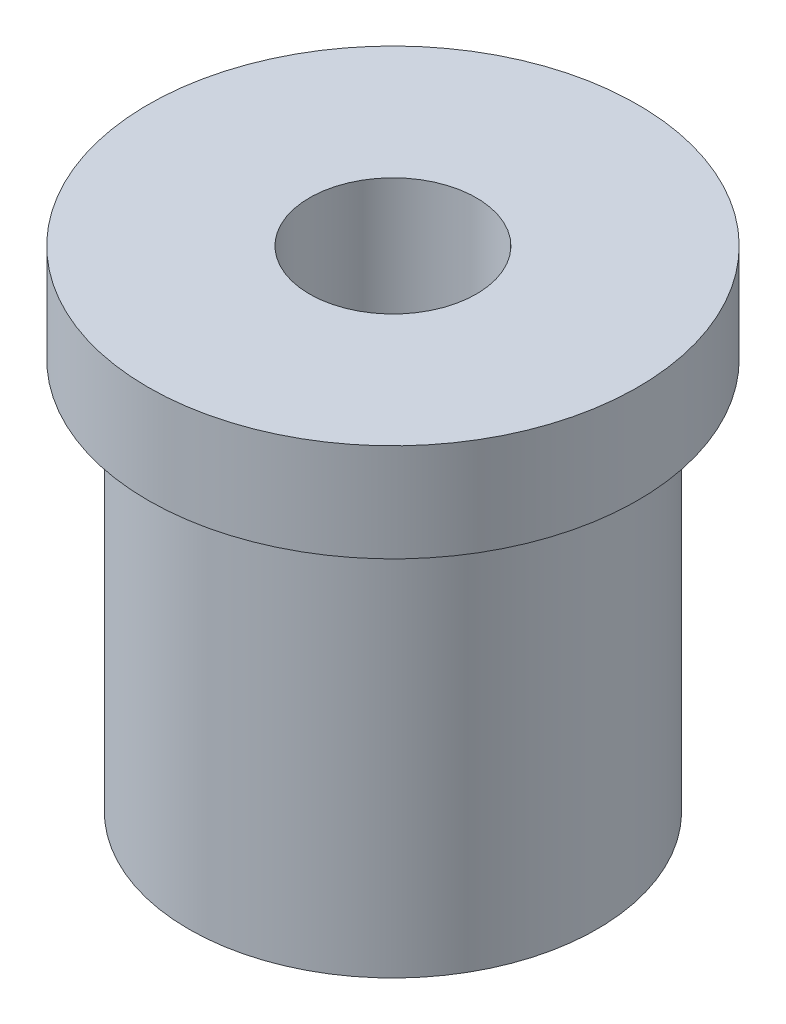
ISO-10303-21;
HEADER;
FILE_DESCRIPTION(('STEP AP214'),'2;1');
FILE_NAME('part.step','',(''),(''),'','','');
FILE_SCHEMA(('AUTOMOTIVE_DESIGN { 1 0 10303 214 1 1 1 1 }'));
ENDSEC;
DATA;
#1=APPLICATION_CONTEXT('core data for automotive mechanical design processes');
#2=APPLICATION_PROTOCOL_DEFINITION('international standard','automotive_design',2000,#1);
#3=PRODUCT_CONTEXT('',#1,'mechanical');
#4=PRODUCT('Part','Part','',(#3));
#5=PRODUCT_RELATED_PRODUCT_CATEGORY('part','',(#4));
#6=PRODUCT_DEFINITION_FORMATION('','',#4);
#7=PRODUCT_DEFINITION_CONTEXT('part definition',#1,'design');
#8=PRODUCT_DEFINITION('design','',#6,#7);
#9=PRODUCT_DEFINITION_SHAPE('','',#8);
#10=(LENGTH_UNIT() NAMED_UNIT(*) SI_UNIT(.MILLI.,.METRE.));
#11=(NAMED_UNIT(*) PLANE_ANGLE_UNIT() SI_UNIT($,.RADIAN.));
#12=(NAMED_UNIT(*) SI_UNIT($,.STERADIAN.) SOLID_ANGLE_UNIT());
#13=UNCERTAINTY_MEASURE_WITH_UNIT(LENGTH_MEASURE(1.E-05),#10,'distance_accuracy_value','');
#14=(GEOMETRIC_REPRESENTATION_CONTEXT(3) GLOBAL_UNCERTAINTY_ASSIGNED_CONTEXT((#13)) GLOBAL_UNIT_ASSIGNED_CONTEXT((#10,
#11,#12)) REPRESENTATION_CONTEXT('',''));
#15=CARTESIAN_POINT('',(0.,0.,0.));
#16=DIRECTION('',(0.,0.,1.));
#17=DIRECTION('',(1.,0.,0.));
#18=AXIS2_PLACEMENT_3D('',#15,#16,#17);
#19=CARTESIAN_POINT('',(0.,3.175,0.));
#20=DIRECTION('',(0.,-1.,0.));
#21=DIRECTION('',(0.,0.,-1.));
#22=AXIS2_PLACEMENT_3D('',#19,#20,#21);
#23=CYLINDRICAL_SURFACE('',#22,7.9375);
#24=CARTESIAN_POINT('',(0.,3.175,0.));
#25=DIRECTION('',(0.,1.,0.));
#26=DIRECTION('',(0.,0.,1.));
#27=AXIS2_PLACEMENT_3D('',#24,#25,#26);
#28=CIRCLE('',#27,7.9375);
#29=CARTESIAN_POINT('',(0.,3.175,7.9375));
#30=VERTEX_POINT('',#29);
#31=EDGE_CURVE('E46',#30,#30,#28,.T.);
#32=ORIENTED_EDGE('',*,*,#31,.F.);
#33=EDGE_LOOP('',(#32));
#34=FACE_BOUND('',#33,.T.);
#35=CARTESIAN_POINT('',(0.,0.,0.));
#36=DIRECTION('',(0.,1.,0.));
#37=DIRECTION('',(0.,0.,1.));
#38=AXIS2_PLACEMENT_3D('',#35,#36,#37);
#39=CIRCLE('',#38,7.9375);
#40=CARTESIAN_POINT('',(0.,0.,7.9375));
#41=VERTEX_POINT('',#40);
#42=EDGE_CURVE('E42',#41,#41,#39,.T.);
#43=ORIENTED_EDGE('',*,*,#42,.T.);
#44=EDGE_LOOP('',(#43));
#45=FACE_BOUND('',#44,.T.);
#46=ADVANCED_FACE('F39',(#34,#45),#23,.T.);
#47=CARTESIAN_POINT('',(0.,3.175,0.));
#48=DIRECTION('',(0.,-1.,0.));
#49=DIRECTION('',(0.,0.,-1.));
#50=AXIS2_PLACEMENT_3D('',#47,#48,#49);
#51=CYLINDRICAL_SURFACE('',#50,2.7051);
#52=CARTESIAN_POINT('',(0.,3.175,0.));
#53=DIRECTION('',(0.,1.,0.));
#54=DIRECTION('',(0.,0.,1.));
#55=AXIS2_PLACEMENT_3D('',#52,#53,#54);
#56=CIRCLE('',#55,2.7051);
#57=CARTESIAN_POINT('',(0.,3.175,2.7051));
#58=VERTEX_POINT('',#57);
#59=EDGE_CURVE('E10',#58,#58,#56,.T.);
#60=ORIENTED_EDGE('',*,*,#59,.T.);
#61=EDGE_LOOP('',(#60));
#62=FACE_BOUND('',#61,.T.);
#63=CARTESIAN_POINT('',(0.,-12.7,0.));
#64=DIRECTION('',(0.,1.,0.));
#65=DIRECTION('',(0.,0.,1.));
#66=AXIS2_PLACEMENT_3D('',#63,#64,#65);
#67=CIRCLE('',#66,2.7051);
#68=CARTESIAN_POINT('',(0.,-12.7,2.7051));
#69=VERTEX_POINT('',#68);
#70=EDGE_CURVE('E55',#69,#69,#67,.T.);
#71=ORIENTED_EDGE('',*,*,#70,.F.);
#72=EDGE_LOOP('',(#71));
#73=FACE_BOUND('',#72,.T.);
#74=ADVANCED_FACE('F65',(#62,#73),#51,.F.);
#75=CARTESIAN_POINT('',(0.,3.175,0.));
#76=DIRECTION('',(0.,1.,0.));
#77=DIRECTION('',(0.,0.,1.));
#78=AXIS2_PLACEMENT_3D('',#75,#76,#77);
#79=PLANE('',#78);
#80=ORIENTED_EDGE('',*,*,#31,.T.);
#81=EDGE_LOOP('',(#80));
#82=FACE_BOUND('',#81,.T.);
#83=ORIENTED_EDGE('',*,*,#59,.F.);
#84=EDGE_LOOP('',(#83));
#85=FACE_BOUND('',#84,.T.);
#86=ADVANCED_FACE('F67',(#82,#85),#79,.T.);
#87=CARTESIAN_POINT('',(0.,0.,0.));
#88=DIRECTION('',(0.,1.,0.));
#89=DIRECTION('',(0.,0.,1.));
#90=AXIS2_PLACEMENT_3D('',#87,#88,#89);
#91=PLANE('',#90);
#92=CARTESIAN_POINT('',(0.,0.,0.));
#93=DIRECTION('',(0.,1.,0.));
#94=DIRECTION('',(0.,0.,1.));
#95=AXIS2_PLACEMENT_3D('',#92,#93,#94);
#96=CIRCLE('',#95,6.6167);
#97=CARTESIAN_POINT('',(0.,0.,6.6167));
#98=VERTEX_POINT('',#97);
#99=EDGE_CURVE('E52',#98,#98,#96,.T.);
#100=ORIENTED_EDGE('',*,*,#99,.T.);
#101=EDGE_LOOP('',(#100));
#102=FACE_BOUND('',#101,.T.);
#103=ORIENTED_EDGE('',*,*,#42,.F.);
#104=EDGE_LOOP('',(#103));
#105=FACE_BOUND('',#104,.T.);
#106=ADVANCED_FACE('F72',(#102,#105),#91,.F.);
#107=CARTESIAN_POINT('',(0.,-12.7,0.));
#108=DIRECTION('',(0.,1.,0.));
#109=DIRECTION('',(0.,0.,1.));
#110=AXIS2_PLACEMENT_3D('',#107,#108,#109);
#111=CYLINDRICAL_SURFACE('',#110,6.6167);
#112=CARTESIAN_POINT('',(0.,-12.7,0.));
#113=DIRECTION('',(0.,1.,0.));
#114=DIRECTION('',(0.,0.,1.));
#115=AXIS2_PLACEMENT_3D('',#112,#113,#114);
#116=CIRCLE('',#115,6.6167);
#117=CARTESIAN_POINT('',(0.,-12.7,6.6167));
#118=VERTEX_POINT('',#117);
#119=EDGE_CURVE('E56',#118,#118,#116,.T.);
#120=ORIENTED_EDGE('',*,*,#119,.T.);
#121=EDGE_LOOP('',(#120));
#122=FACE_BOUND('',#121,.T.);
#123=ORIENTED_EDGE('',*,*,#99,.F.);
#124=EDGE_LOOP('',(#123));
#125=FACE_BOUND('',#124,.T.);
#126=ADVANCED_FACE('F78',(#122,#125),#111,.T.);
#127=CARTESIAN_POINT('',(0.,-12.7,0.));
#128=DIRECTION('',(0.,1.,0.));
#129=DIRECTION('',(0.,0.,1.));
#130=AXIS2_PLACEMENT_3D('',#127,#128,#129);
#131=PLANE('',#130);
#132=ORIENTED_EDGE('',*,*,#70,.T.);
#133=EDGE_LOOP('',(#132));
#134=FACE_BOUND('',#133,.T.);
#135=ORIENTED_EDGE('',*,*,#119,.F.);
#136=EDGE_LOOP('',(#135));
#137=FACE_BOUND('',#136,.T.);
#138=ADVANCED_FACE('F62',(#134,#137),#131,.F.);
#139=CLOSED_SHELL('',(#46,#74,#86,#106,#126,#138));
#140=MANIFOLD_SOLID_BREP('B2',#139);
#141=ADVANCED_BREP_SHAPE_REPRESENTATION('',(#18,#140),#14);
#142=SHAPE_DEFINITION_REPRESENTATION(#9,#141);
ENDSEC;
END-ISO-10303-21;
